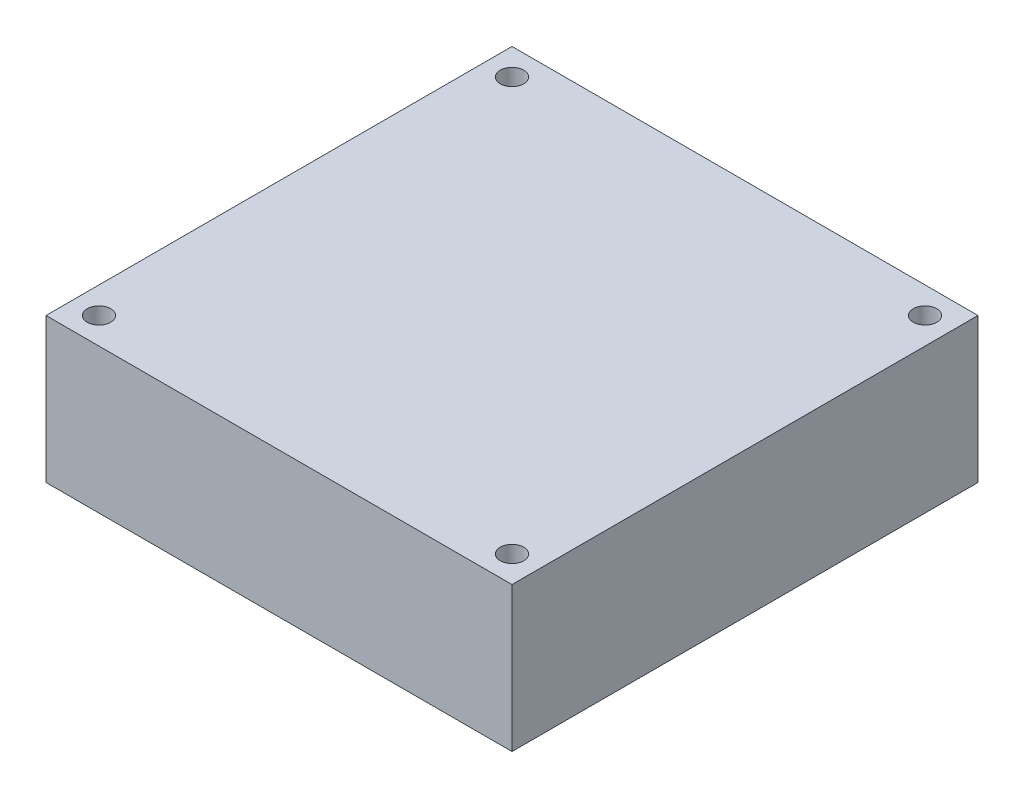
ISO-10303-21;
HEADER;
FILE_DESCRIPTION(('STEP AP214'),'2;1');
FILE_NAME('part.step','',(''),(''),'','','');
FILE_SCHEMA(('AUTOMOTIVE_DESIGN { 1 0 10303 214 1 1 1 1 }'));
ENDSEC;
DATA;
#1=APPLICATION_CONTEXT('core data for automotive mechanical design processes');
#2=APPLICATION_PROTOCOL_DEFINITION('international standard','automotive_design',2000,#1);
#3=PRODUCT_CONTEXT('',#1,'mechanical');
#4=PRODUCT('Part','Part','',(#3));
#5=PRODUCT_RELATED_PRODUCT_CATEGORY('part','',(#4));
#6=PRODUCT_DEFINITION_FORMATION('','',#4);
#7=PRODUCT_DEFINITION_CONTEXT('part definition',#1,'design');
#8=PRODUCT_DEFINITION('design','',#6,#7);
#9=PRODUCT_DEFINITION_SHAPE('','',#8);
#10=(LENGTH_UNIT() NAMED_UNIT(*) SI_UNIT(.MILLI.,.METRE.));
#11=(NAMED_UNIT(*) PLANE_ANGLE_UNIT() SI_UNIT($,.RADIAN.));
#12=(NAMED_UNIT(*) SI_UNIT($,.STERADIAN.) SOLID_ANGLE_UNIT());
#13=UNCERTAINTY_MEASURE_WITH_UNIT(LENGTH_MEASURE(1.E-05),#10,'distance_accuracy_value','');
#14=(GEOMETRIC_REPRESENTATION_CONTEXT(3) GLOBAL_UNCERTAINTY_ASSIGNED_CONTEXT((#13)) GLOBAL_UNIT_ASSIGNED_CONTEXT((#10,
#11,#12)) REPRESENTATION_CONTEXT('',''));
#15=CARTESIAN_POINT('',(0.,0.,0.));
#16=DIRECTION('',(0.,0.,1.));
#17=DIRECTION('',(1.,0.,0.));
#18=AXIS2_PLACEMENT_3D('',#15,#16,#17);
#19=CARTESIAN_POINT('',(0.,24.9936,0.));
#20=DIRECTION('',(1.,0.,0.));
#21=DIRECTION('',(0.,0.,-1.));
#22=AXIS2_PLACEMENT_3D('',#19,#20,#21);
#23=PLANE('',#22);
#24=DIRECTION('',(0.,0.,1.));
#25=VECTOR('',#24,1.);
#26=CARTESIAN_POINT('',(0.,0.,0.));
#27=LINE('',#26,#25);
#28=CARTESIAN_POINT('',(0.,0.,-80.518));
#29=VERTEX_POINT('',#28);
#30=CARTESIAN_POINT('',(0.,0.,0.));
#31=VERTEX_POINT('',#30);
#32=EDGE_CURVE('E107',#29,#31,#27,.T.);
#33=ORIENTED_EDGE('',*,*,#32,.T.);
#34=DIRECTION('',(0.,-1.,0.));
#35=VECTOR('',#34,1.);
#36=CARTESIAN_POINT('',(0.,24.9936,0.));
#37=LINE('',#36,#35);
#38=CARTESIAN_POINT('',(0.,24.9936,0.));
#39=VERTEX_POINT('',#38);
#40=EDGE_CURVE('E11',#39,#31,#37,.T.);
#41=ORIENTED_EDGE('',*,*,#40,.F.);
#42=DIRECTION('',(0.,0.,1.));
#43=VECTOR('',#42,1.);
#44=CARTESIAN_POINT('',(0.,24.9936,0.));
#45=LINE('',#44,#43);
#46=CARTESIAN_POINT('',(0.,24.9936,-80.518));
#47=VERTEX_POINT('',#46);
#48=EDGE_CURVE('E91',#47,#39,#45,.T.);
#49=ORIENTED_EDGE('',*,*,#48,.F.);
#50=DIRECTION('',(0.,-1.,0.));
#51=VECTOR('',#50,1.);
#52=CARTESIAN_POINT('',(0.,24.9936,-80.518));
#53=LINE('',#52,#51);
#54=EDGE_CURVE('E103',#47,#29,#53,.T.);
#55=ORIENTED_EDGE('',*,*,#54,.T.);
#56=EDGE_LOOP('',(#33,#41,#49,#55));
#57=FACE_BOUND('',#56,.T.);
#58=ADVANCED_FACE('F39',(#57),#23,.F.);
#59=CARTESIAN_POINT('',(0.,24.9936,0.));
#60=DIRECTION('',(0.,0.,-1.));
#61=DIRECTION('',(-1.,0.,0.));
#62=AXIS2_PLACEMENT_3D('',#59,#60,#61);
#63=PLANE('',#62);
#64=DIRECTION('',(1.,0.,0.));
#65=VECTOR('',#64,1.);
#66=CARTESIAN_POINT('',(0.,0.,0.));
#67=LINE('',#66,#65);
#68=CARTESIAN_POINT('',(80.518,0.,0.));
#69=VERTEX_POINT('',#68);
#70=EDGE_CURVE('E96',#31,#69,#67,.T.);
#71=ORIENTED_EDGE('',*,*,#70,.T.);
#72=DIRECTION('',(0.,-1.,0.));
#73=VECTOR('',#72,1.);
#74=CARTESIAN_POINT('',(80.518,24.9936,0.));
#75=LINE('',#74,#73);
#76=CARTESIAN_POINT('',(80.518,24.9936,0.));
#77=VERTEX_POINT('',#76);
#78=EDGE_CURVE('E48',#77,#69,#75,.T.);
#79=ORIENTED_EDGE('',*,*,#78,.F.);
#80=DIRECTION('',(1.,0.,0.));
#81=VECTOR('',#80,1.);
#82=CARTESIAN_POINT('',(0.,24.9936,0.));
#83=LINE('',#82,#81);
#84=EDGE_CURVE('E86',#39,#77,#83,.T.);
#85=ORIENTED_EDGE('',*,*,#84,.F.);
#86=ORIENTED_EDGE('',*,*,#40,.T.);
#87=EDGE_LOOP('',(#71,#79,#85,#86));
#88=FACE_BOUND('',#87,.T.);
#89=ADVANCED_FACE('F95',(#88),#63,.F.);
#90=CARTESIAN_POINT('',(80.518,24.9936,0.));
#91=DIRECTION('',(-1.,0.,0.));
#92=DIRECTION('',(0.,0.,1.));
#93=AXIS2_PLACEMENT_3D('',#90,#91,#92);
#94=PLANE('',#93);
#95=DIRECTION('',(0.,0.,-1.));
#96=VECTOR('',#95,1.);
#97=CARTESIAN_POINT('',(80.518,0.,0.));
#98=LINE('',#97,#96);
#99=CARTESIAN_POINT('',(80.518,0.,-80.518));
#100=VERTEX_POINT('',#99);
#101=EDGE_CURVE('E73',#69,#100,#98,.T.);
#102=ORIENTED_EDGE('',*,*,#101,.T.);
#103=DIRECTION('',(0.,-1.,0.));
#104=VECTOR('',#103,1.);
#105=CARTESIAN_POINT('',(80.518,24.9936,-80.518));
#106=LINE('',#105,#104);
#107=CARTESIAN_POINT('',(80.518,24.9936,-80.518));
#108=VERTEX_POINT('',#107);
#109=EDGE_CURVE('E98',#108,#100,#106,.T.);
#110=ORIENTED_EDGE('',*,*,#109,.F.);
#111=DIRECTION('',(0.,0.,-1.));
#112=VECTOR('',#111,1.);
#113=CARTESIAN_POINT('',(80.518,24.9936,0.));
#114=LINE('',#113,#112);
#115=EDGE_CURVE('E89',#77,#108,#114,.T.);
#116=ORIENTED_EDGE('',*,*,#115,.F.);
#117=ORIENTED_EDGE('',*,*,#78,.T.);
#118=EDGE_LOOP('',(#102,#110,#116,#117));
#119=FACE_BOUND('',#118,.T.);
#120=ADVANCED_FACE('F99',(#119),#94,.F.);
#121=CARTESIAN_POINT('',(0.,24.9936,-80.518));
#122=DIRECTION('',(0.,0.,1.));
#123=DIRECTION('',(1.,0.,0.));
#124=AXIS2_PLACEMENT_3D('',#121,#122,#123);
#125=PLANE('',#124);
#126=DIRECTION('',(-1.,0.,0.));
#127=VECTOR('',#126,1.);
#128=CARTESIAN_POINT('',(0.,0.,-80.518));
#129=LINE('',#128,#127);
#130=EDGE_CURVE('E79',#100,#29,#129,.T.);
#131=ORIENTED_EDGE('',*,*,#130,.T.);
#132=ORIENTED_EDGE('',*,*,#54,.F.);
#133=DIRECTION('',(-1.,0.,0.));
#134=VECTOR('',#133,1.);
#135=CARTESIAN_POINT('',(0.,24.9936,-80.518));
#136=LINE('',#135,#134);
#137=EDGE_CURVE('E56',#108,#47,#136,.T.);
#138=ORIENTED_EDGE('',*,*,#137,.F.);
#139=ORIENTED_EDGE('',*,*,#109,.T.);
#140=EDGE_LOOP('',(#131,#132,#138,#139));
#141=FACE_BOUND('',#140,.T.);
#142=ADVANCED_FACE('F121',(#141),#125,.F.);
#143=CARTESIAN_POINT('',(0.,24.9936,0.));
#144=DIRECTION('',(0.,-1.,0.));
#145=DIRECTION('',(0.,0.,-1.));
#146=AXIS2_PLACEMENT_3D('',#143,#144,#145);
#147=PLANE('',#146);
#148=CARTESIAN_POINT('',(4.57200000000001,24.9936,-4.57199999999999));
#149=DIRECTION('',(0.,-1.,0.));
#150=DIRECTION('',(0.,0.,-1.));
#151=AXIS2_PLACEMENT_3D('',#148,#149,#150);
#152=CIRCLE('',#151,2.032);
#153=CARTESIAN_POINT('',(4.57200000000001,24.9936,-6.60399999999999));
#154=VERTEX_POINT('',#153);
#155=EDGE_CURVE('E152',#154,#154,#152,.T.);
#156=ORIENTED_EDGE('',*,*,#155,.T.);
#157=EDGE_LOOP('',(#156));
#158=FACE_BOUND('',#157,.T.);
#159=CARTESIAN_POINT('',(75.946,24.9936,-4.57199999999999));
#160=DIRECTION('',(0.,-1.,0.));
#161=DIRECTION('',(0.,0.,-1.));
#162=AXIS2_PLACEMENT_3D('',#159,#160,#161);
#163=CIRCLE('',#162,2.03200000000001);
#164=CARTESIAN_POINT('',(75.946,24.9936,-6.604));
#165=VERTEX_POINT('',#164);
#166=EDGE_CURVE('E144',#165,#165,#163,.T.);
#167=ORIENTED_EDGE('',*,*,#166,.T.);
#168=EDGE_LOOP('',(#167));
#169=FACE_BOUND('',#168,.T.);
#170=CARTESIAN_POINT('',(4.57200000000001,24.9936,-75.946));
#171=DIRECTION('',(0.,1.,0.));
#172=DIRECTION('',(0.,0.,1.));
#173=AXIS2_PLACEMENT_3D('',#170,#171,#172);
#174=CIRCLE('',#173,2.032);
#175=CARTESIAN_POINT('',(4.57200000000001,24.9936,-73.914));
#176=VERTEX_POINT('',#175);
#177=EDGE_CURVE('E137',#176,#176,#174,.T.);
#178=ORIENTED_EDGE('',*,*,#177,.F.);
#179=EDGE_LOOP('',(#178));
#180=FACE_BOUND('',#179,.T.);
#181=CARTESIAN_POINT('',(75.946,24.9936,-75.946));
#182=DIRECTION('',(0.,1.,0.));
#183=DIRECTION('',(0.,0.,1.));
#184=AXIS2_PLACEMENT_3D('',#181,#182,#183);
#185=CIRCLE('',#184,2.03200000000001);
#186=CARTESIAN_POINT('',(75.946,24.9936,-73.914));
#187=VERTEX_POINT('',#186);
#188=EDGE_CURVE('E128',#187,#187,#185,.T.);
#189=ORIENTED_EDGE('',*,*,#188,.F.);
#190=EDGE_LOOP('',(#189));
#191=FACE_BOUND('',#190,.T.);
#192=ORIENTED_EDGE('',*,*,#48,.T.);
#193=ORIENTED_EDGE('',*,*,#84,.T.);
#194=ORIENTED_EDGE('',*,*,#115,.T.);
#195=ORIENTED_EDGE('',*,*,#137,.T.);
#196=EDGE_LOOP('',(#192,#193,#194,#195));
#197=FACE_BOUND('',#196,.T.);
#198=ADVANCED_FACE('F87',(#158,#169,#180,#191,#197),#147,.F.);
#199=CARTESIAN_POINT('',(0.,0.,0.));
#200=DIRECTION('',(0.,-1.,0.));
#201=DIRECTION('',(0.,0.,-1.));
#202=AXIS2_PLACEMENT_3D('',#199,#200,#201);
#203=PLANE('',#202);
#204=CARTESIAN_POINT('',(4.57200000000001,0.,-4.57199999999999));
#205=DIRECTION('',(0.,-1.,0.));
#206=DIRECTION('',(0.,0.,-1.));
#207=AXIS2_PLACEMENT_3D('',#204,#205,#206);
#208=CIRCLE('',#207,2.032);
#209=CARTESIAN_POINT('',(4.57200000000001,0.,-6.60399999999999));
#210=VERTEX_POINT('',#209);
#211=EDGE_CURVE('E133',#210,#210,#208,.T.);
#212=ORIENTED_EDGE('',*,*,#211,.F.);
#213=EDGE_LOOP('',(#212));
#214=FACE_BOUND('',#213,.T.);
#215=CARTESIAN_POINT('',(75.946,0.,-4.57199999999999));
#216=DIRECTION('',(0.,-1.,0.));
#217=DIRECTION('',(0.,0.,-1.));
#218=AXIS2_PLACEMENT_3D('',#215,#216,#217);
#219=CIRCLE('',#218,2.03200000000001);
#220=CARTESIAN_POINT('',(75.946,0.,-6.604));
#221=VERTEX_POINT('',#220);
#222=EDGE_CURVE('E148',#221,#221,#219,.T.);
#223=ORIENTED_EDGE('',*,*,#222,.F.);
#224=EDGE_LOOP('',(#223));
#225=FACE_BOUND('',#224,.T.);
#226=CARTESIAN_POINT('',(4.57200000000001,0.,-75.946));
#227=DIRECTION('',(0.,1.,0.));
#228=DIRECTION('',(0.,0.,1.));
#229=AXIS2_PLACEMENT_3D('',#226,#227,#228);
#230=CIRCLE('',#229,2.032);
#231=CARTESIAN_POINT('',(4.57200000000001,0.,-73.914));
#232=VERTEX_POINT('',#231);
#233=EDGE_CURVE('E111',#232,#232,#230,.T.);
#234=ORIENTED_EDGE('',*,*,#233,.T.);
#235=EDGE_LOOP('',(#234));
#236=FACE_BOUND('',#235,.T.);
#237=CARTESIAN_POINT('',(75.946,0.,-75.946));
#238=DIRECTION('',(0.,1.,0.));
#239=DIRECTION('',(0.,0.,1.));
#240=AXIS2_PLACEMENT_3D('',#237,#238,#239);
#241=CIRCLE('',#240,2.03200000000001);
#242=CARTESIAN_POINT('',(75.946,0.,-73.914));
#243=VERTEX_POINT('',#242);
#244=EDGE_CURVE('E132',#243,#243,#241,.T.);
#245=ORIENTED_EDGE('',*,*,#244,.T.);
#246=EDGE_LOOP('',(#245));
#247=FACE_BOUND('',#246,.T.);
#248=ORIENTED_EDGE('',*,*,#32,.F.);
#249=ORIENTED_EDGE('',*,*,#130,.F.);
#250=ORIENTED_EDGE('',*,*,#101,.F.);
#251=ORIENTED_EDGE('',*,*,#70,.F.);
#252=EDGE_LOOP('',(#248,#249,#250,#251));
#253=FACE_BOUND('',#252,.T.);
#254=ADVANCED_FACE('F124',(#214,#225,#236,#247,#253),#203,.T.);
#255=CARTESIAN_POINT('',(75.946,0.,-75.946));
#256=DIRECTION('',(0.,1.,0.));
#257=DIRECTION('',(0.,0.,1.));
#258=AXIS2_PLACEMENT_3D('',#255,#256,#257);
#259=CYLINDRICAL_SURFACE('',#258,2.03200000000001);
#260=ORIENTED_EDGE('',*,*,#244,.F.);
#261=EDGE_LOOP('',(#260));
#262=FACE_BOUND('',#261,.T.);
#263=ORIENTED_EDGE('',*,*,#188,.T.);
#264=EDGE_LOOP('',(#263));
#265=FACE_BOUND('',#264,.T.);
#266=ADVANCED_FACE('F165',(#262,#265),#259,.F.);
#267=CARTESIAN_POINT('',(4.57200000000001,0.,-75.946));
#268=DIRECTION('',(0.,1.,0.));
#269=DIRECTION('',(0.,0.,1.));
#270=AXIS2_PLACEMENT_3D('',#267,#268,#269);
#271=CYLINDRICAL_SURFACE('',#270,2.032);
#272=ORIENTED_EDGE('',*,*,#233,.F.);
#273=EDGE_LOOP('',(#272));
#274=FACE_BOUND('',#273,.T.);
#275=ORIENTED_EDGE('',*,*,#177,.T.);
#276=EDGE_LOOP('',(#275));
#277=FACE_BOUND('',#276,.T.);
#278=ADVANCED_FACE('F175',(#274,#277),#271,.F.);
#279=CARTESIAN_POINT('',(75.946,0.,-4.57199999999999));
#280=DIRECTION('',(0.,1.,0.));
#281=DIRECTION('',(0.,0.,1.));
#282=AXIS2_PLACEMENT_3D('',#279,#280,#281);
#283=CYLINDRICAL_SURFACE('',#282,2.03200000000001);
#284=ORIENTED_EDGE('',*,*,#222,.T.);
#285=EDGE_LOOP('',(#284));
#286=FACE_BOUND('',#285,.T.);
#287=ORIENTED_EDGE('',*,*,#166,.F.);
#288=EDGE_LOOP('',(#287));
#289=FACE_BOUND('',#288,.T.);
#290=ADVANCED_FACE('F217',(#286,#289),#283,.F.);
#291=CARTESIAN_POINT('',(4.57200000000001,0.,-4.57199999999999));
#292=DIRECTION('',(0.,1.,0.));
#293=DIRECTION('',(0.,0.,1.));
#294=AXIS2_PLACEMENT_3D('',#291,#292,#293);
#295=CYLINDRICAL_SURFACE('',#294,2.032);
#296=ORIENTED_EDGE('',*,*,#211,.T.);
#297=EDGE_LOOP('',(#296));
#298=FACE_BOUND('',#297,.T.);
#299=ORIENTED_EDGE('',*,*,#155,.F.);
#300=EDGE_LOOP('',(#299));
#301=FACE_BOUND('',#300,.T.);
#302=ADVANCED_FACE('F160',(#298,#301),#295,.F.);
#303=CLOSED_SHELL('',(#58,#89,#120,#142,#198,#254,#266,#278,#290,#302));
#304=MANIFOLD_SOLID_BREP('B2',#303);
#305=ADVANCED_BREP_SHAPE_REPRESENTATION('',(#18,#304),#14);
#306=SHAPE_DEFINITION_REPRESENTATION(#9,#305);
ENDSEC;
END-ISO-10303-21;
